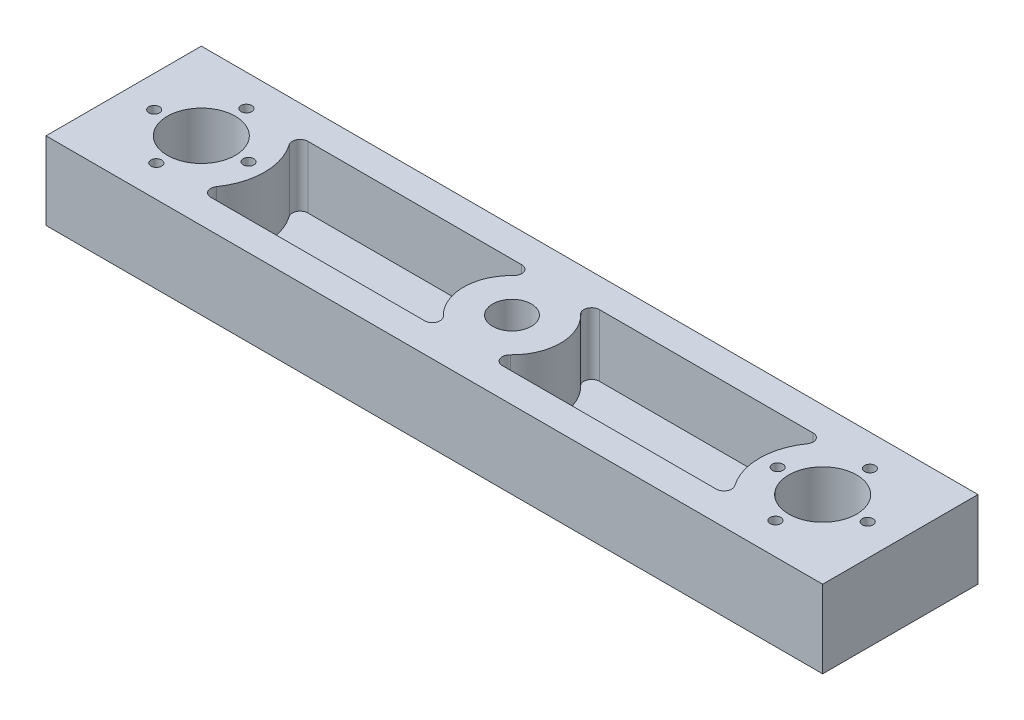
ISO-10303-21;
HEADER;
FILE_DESCRIPTION(('STEP AP214'),'2;1');
FILE_NAME('part.step','',(''),(''),'','','');
FILE_SCHEMA(('AUTOMOTIVE_DESIGN { 1 0 10303 214 1 1 1 1 }'));
ENDSEC;
DATA;
#1=APPLICATION_CONTEXT('core data for automotive mechanical design processes');
#2=APPLICATION_PROTOCOL_DEFINITION('international standard','automotive_design',2000,#1);
#3=PRODUCT_CONTEXT('',#1,'mechanical');
#4=PRODUCT('Part','Part','',(#3));
#5=PRODUCT_RELATED_PRODUCT_CATEGORY('part','',(#4));
#6=PRODUCT_DEFINITION_FORMATION('','',#4);
#7=PRODUCT_DEFINITION_CONTEXT('part definition',#1,'design');
#8=PRODUCT_DEFINITION('design','',#6,#7);
#9=PRODUCT_DEFINITION_SHAPE('','',#8);
#10=(LENGTH_UNIT() NAMED_UNIT(*) SI_UNIT(.MILLI.,.METRE.));
#11=(NAMED_UNIT(*) PLANE_ANGLE_UNIT() SI_UNIT($,.RADIAN.));
#12=(NAMED_UNIT(*) SI_UNIT($,.STERADIAN.) SOLID_ANGLE_UNIT());
#13=UNCERTAINTY_MEASURE_WITH_UNIT(LENGTH_MEASURE(1.E-05),#10,'distance_accuracy_value','');
#14=(GEOMETRIC_REPRESENTATION_CONTEXT(3) GLOBAL_UNCERTAINTY_ASSIGNED_CONTEXT((#13)) GLOBAL_UNIT_ASSIGNED_CONTEXT((#10,
#11,#12)) REPRESENTATION_CONTEXT('',''));
#15=CARTESIAN_POINT('',(0.,0.,0.));
#16=DIRECTION('',(0.,0.,1.));
#17=DIRECTION('',(1.,0.,0.));
#18=AXIS2_PLACEMENT_3D('',#15,#16,#17);
#19=CARTESIAN_POINT('',(0.,25.4,0.));
#20=DIRECTION('',(0.,1.,0.));
#21=DIRECTION('',(0.,0.,1.));
#22=AXIS2_PLACEMENT_3D('',#19,#20,#21);
#23=PLANE('',#22);
#24=CARTESIAN_POINT('',(228.245657607754,25.4,-10.3187499999999));
#25=DIRECTION('',(0.,1.,0.));
#26=DIRECTION('',(0.,0.,1.));
#27=AXIS2_PLACEMENT_3D('',#24,#25,#26);
#28=CIRCLE('',#27,1.75259999999999);
#29=CARTESIAN_POINT('',(228.245657607754,25.4,-8.56614999999991));
#30=VERTEX_POINT('',#29);
#31=EDGE_CURVE('E781',#30,#30,#28,.T.);
#32=ORIENTED_EDGE('',*,*,#31,.F.);
#33=EDGE_LOOP('',(#32));
#34=FACE_BOUND('',#33,.T.);
#35=CARTESIAN_POINT('',(213.51875,25.4,-25.7543423922459));
#36=DIRECTION('',(0.,1.,0.));
#37=DIRECTION('',(0.,0.,1.));
#38=AXIS2_PLACEMENT_3D('',#35,#36,#37);
#39=CIRCLE('',#38,1.75259999999999);
#40=CARTESIAN_POINT('',(213.51875,25.4,-24.0017423922459));
#41=VERTEX_POINT('',#40);
#42=EDGE_CURVE('E783',#41,#41,#39,.T.);
#43=ORIENTED_EDGE('',*,*,#42,.F.);
#44=EDGE_LOOP('',(#43));
#45=FACE_BOUND('',#44,.T.);
#46=CARTESIAN_POINT('',(228.954342392246,25.4,-40.4812500000001));
#47=DIRECTION('',(0.,1.,0.));
#48=DIRECTION('',(0.,0.,1.));
#49=AXIS2_PLACEMENT_3D('',#46,#47,#48);
#50=CIRCLE('',#49,1.75259999999999);
#51=CARTESIAN_POINT('',(228.954342392246,25.4,-38.7286500000001));
#52=VERTEX_POINT('',#51);
#53=EDGE_CURVE('E791',#52,#52,#50,.T.);
#54=ORIENTED_EDGE('',*,*,#53,.F.);
#55=EDGE_LOOP('',(#54));
#56=FACE_BOUND('',#55,.T.);
#57=CARTESIAN_POINT('',(25.045657607754,25.4,-40.48125));
#58=DIRECTION('',(0.,1.,0.));
#59=DIRECTION('',(0.,0.,1.));
#60=AXIS2_PLACEMENT_3D('',#57,#58,#59);
#61=CIRCLE('',#60,1.75259999999999);
#62=CARTESIAN_POINT('',(25.045657607754,25.4,-38.72865));
#63=VERTEX_POINT('',#62);
#64=EDGE_CURVE('E797',#63,#63,#61,.T.);
#65=ORIENTED_EDGE('',*,*,#64,.F.);
#66=EDGE_LOOP('',(#65));
#67=FACE_BOUND('',#66,.T.);
#68=CARTESIAN_POINT('',(40.48125,25.4,-25.7543423922459));
#69=DIRECTION('',(0.,1.,0.));
#70=DIRECTION('',(0.,0.,1.));
#71=AXIS2_PLACEMENT_3D('',#68,#69,#70);
#72=CIRCLE('',#71,1.75259999999999);
#73=CARTESIAN_POINT('',(40.48125,25.4,-24.0017423922459));
#74=VERTEX_POINT('',#73);
#75=EDGE_CURVE('E803',#74,#74,#72,.T.);
#76=ORIENTED_EDGE('',*,*,#75,.F.);
#77=EDGE_LOOP('',(#76));
#78=FACE_BOUND('',#77,.T.);
#79=CARTESIAN_POINT('',(25.7543423922459,25.4,-10.31875));
#80=DIRECTION('',(0.,1.,0.));
#81=DIRECTION('',(0.,0.,1.));
#82=AXIS2_PLACEMENT_3D('',#79,#80,#81);
#83=CIRCLE('',#82,1.75259999999999);
#84=CARTESIAN_POINT('',(25.7543423922459,25.4,-8.56615000000002));
#85=VERTEX_POINT('',#84);
#86=EDGE_CURVE('E808',#85,#85,#83,.T.);
#87=ORIENTED_EDGE('',*,*,#86,.F.);
#88=EDGE_LOOP('',(#87));
#89=FACE_BOUND('',#88,.T.);
#90=CARTESIAN_POINT('',(209.642830347069,25.4,-12.065));
#91=DIRECTION('',(0.,1.,0.));
#92=DIRECTION('',(0.,0.,-1.));
#93=AXIS2_PLACEMENT_3D('',#90,#91,#92);
#94=CIRCLE('',#93,2.54);
#95=CARTESIAN_POINT('',(209.642830347069,25.4,-9.525));
#96=VERTEX_POINT('',#95);
#97=CARTESIAN_POINT('',(211.720328391226,25.4,-13.5263698630137));
#98=VERTEX_POINT('',#97);
#99=EDGE_CURVE('E69',#96,#98,#94,.T.);
#100=ORIENTED_EDGE('',*,*,#99,.F.);
#101=DIRECTION('',(1.,0.,0.));
#102=VECTOR('',#101,1.);
#103=CARTESIAN_POINT('',(209.642830347069,25.4,-9.525));
#104=LINE('',#103,#102);
#105=CARTESIAN_POINT('',(139.7,25.4,-9.52499999999999));
#106=VERTEX_POINT('',#105);
#107=EDGE_CURVE('E274',#106,#96,#104,.T.);
#108=ORIENTED_EDGE('',*,*,#107,.F.);
#109=CARTESIAN_POINT('',(139.7,25.4,-12.065));
#110=DIRECTION('',(0.,1.,0.));
#111=DIRECTION('',(0.,0.,1.));
#112=AXIS2_PLACEMENT_3D('',#109,#110,#111);
#113=CIRCLE('',#112,2.54);
#114=CARTESIAN_POINT('',(137.948275862069,25.4,-13.9043103448276));
#115=VERTEX_POINT('',#114);
#116=EDGE_CURVE('E277',#115,#106,#113,.T.);
#117=ORIENTED_EDGE('',*,*,#116,.F.);
#118=CARTESIAN_POINT('',(127.,25.4,-25.4));
#119=DIRECTION('',(0.,-1.,0.));
#120=DIRECTION('',(0.,0.,-1.));
#121=AXIS2_PLACEMENT_3D('',#118,#119,#120);
#122=CIRCLE('',#121,15.875);
#123=CARTESIAN_POINT('',(137.948275862069,25.4,-36.8956896551724));
#124=VERTEX_POINT('',#123);
#125=EDGE_CURVE('E281',#124,#115,#122,.T.);
#126=ORIENTED_EDGE('',*,*,#125,.F.);
#127=CARTESIAN_POINT('',(139.7,25.4,-38.735));
#128=DIRECTION('',(0.,1.,0.));
#129=DIRECTION('',(0.,0.,-1.));
#130=AXIS2_PLACEMENT_3D('',#127,#128,#129);
#131=CIRCLE('',#130,2.54);
#132=CARTESIAN_POINT('',(139.7,25.4,-41.275));
#133=VERTEX_POINT('',#132);
#134=EDGE_CURVE('E284',#133,#124,#131,.T.);
#135=ORIENTED_EDGE('',*,*,#134,.F.);
#136=DIRECTION('',(-1.,0.,0.));
#137=VECTOR('',#136,1.);
#138=CARTESIAN_POINT('',(209.642830347069,25.4,-41.275));
#139=LINE('',#138,#137);
#140=CARTESIAN_POINT('',(209.642830347069,25.4,-41.275));
#141=VERTEX_POINT('',#140);
#142=EDGE_CURVE('E287',#141,#133,#139,.T.);
#143=ORIENTED_EDGE('',*,*,#142,.F.);
#144=CARTESIAN_POINT('',(209.642830347069,25.4,-38.735));
#145=DIRECTION('',(0.,1.,0.));
#146=DIRECTION('',(0.,0.,1.));
#147=AXIS2_PLACEMENT_3D('',#144,#145,#146);
#148=CIRCLE('',#147,2.54);
#149=CARTESIAN_POINT('',(211.720328391226,25.4,-37.2736301369863));
#150=VERTEX_POINT('',#149);
#151=EDGE_CURVE('E290',#150,#141,#148,.T.);
#152=ORIENTED_EDGE('',*,*,#151,.F.);
#153=CARTESIAN_POINT('',(228.6,25.4,-25.4));
#154=DIRECTION('',(0.,-1.,0.));
#155=DIRECTION('',(0.,0.,1.));
#156=AXIS2_PLACEMENT_3D('',#153,#154,#155);
#157=CIRCLE('',#156,20.6375);
#158=EDGE_CURVE('E293',#98,#150,#157,.T.);
#159=ORIENTED_EDGE('',*,*,#158,.F.);
#160=EDGE_LOOP('',(#100,#108,#117,#126,#135,#143,#152,#159));
#161=FACE_BOUND('',#160,.T.);
#162=CARTESIAN_POINT('',(10.31875,25.4,-25.0456576077541));
#163=DIRECTION('',(0.,1.,0.));
#164=DIRECTION('',(0.,0.,1.));
#165=AXIS2_PLACEMENT_3D('',#162,#163,#164);
#166=CIRCLE('',#165,1.75259999999999);
#167=CARTESIAN_POINT('',(10.31875,25.4,-23.2930576077541));
#168=VERTEX_POINT('',#167);
#169=EDGE_CURVE('E245',#168,#168,#166,.T.);
#170=ORIENTED_EDGE('',*,*,#169,.F.);
#171=EDGE_LOOP('',(#170));
#172=FACE_BOUND('',#171,.T.);
#173=CARTESIAN_POINT('',(243.68125,25.4,-25.0456576077541));
#174=DIRECTION('',(0.,1.,0.));
#175=DIRECTION('',(0.,0.,1.));
#176=AXIS2_PLACEMENT_3D('',#173,#174,#175);
#177=CIRCLE('',#176,1.75259999999999);
#178=CARTESIAN_POINT('',(243.68125,25.4,-23.2930576077542));
#179=VERTEX_POINT('',#178);
#180=EDGE_CURVE('E324',#179,#179,#177,.T.);
#181=ORIENTED_EDGE('',*,*,#180,.F.);
#182=EDGE_LOOP('',(#181));
#183=FACE_BOUND('',#182,.T.);
#184=CARTESIAN_POINT('',(25.4,25.4,-25.4));
#185=DIRECTION('',(0.,1.,0.));
#186=DIRECTION('',(0.,0.,1.));
#187=AXIS2_PLACEMENT_3D('',#184,#185,#186);
#188=CIRCLE('',#187,11.1125);
#189=CARTESIAN_POINT('',(25.4,25.4,-14.2875));
#190=VERTEX_POINT('',#189);
#191=EDGE_CURVE('E335',#190,#190,#188,.T.);
#192=ORIENTED_EDGE('',*,*,#191,.F.);
#193=EDGE_LOOP('',(#192));
#194=FACE_BOUND('',#193,.T.);
#195=CARTESIAN_POINT('',(228.6,25.4,-25.4));
#196=DIRECTION('',(0.,1.,0.));
#197=DIRECTION('',(0.,0.,1.));
#198=AXIS2_PLACEMENT_3D('',#195,#196,#197);
#199=CIRCLE('',#198,11.1125);
#200=CARTESIAN_POINT('',(228.6,25.4,-14.2875));
#201=VERTEX_POINT('',#200);
#202=EDGE_CURVE('E338',#201,#201,#199,.T.);
#203=ORIENTED_EDGE('',*,*,#202,.F.);
#204=EDGE_LOOP('',(#203));
#205=FACE_BOUND('',#204,.T.);
#206=CARTESIAN_POINT('',(127.,25.4,-25.4));
#207=DIRECTION('',(0.,1.,0.));
#208=DIRECTION('',(0.,0.,1.));
#209=AXIS2_PLACEMENT_3D('',#206,#207,#208);
#210=CIRCLE('',#209,6.35000000000002);
#211=CARTESIAN_POINT('',(127.,25.4,-19.05));
#212=VERTEX_POINT('',#211);
#213=EDGE_CURVE('E344',#212,#212,#210,.T.);
#214=ORIENTED_EDGE('',*,*,#213,.F.);
#215=EDGE_LOOP('',(#214));
#216=FACE_BOUND('',#215,.T.);
#217=DIRECTION('',(0.,0.,1.));
#218=VECTOR('',#217,1.);
#219=CARTESIAN_POINT('',(0.,25.4,-50.8));
#220=LINE('',#219,#218);
#221=CARTESIAN_POINT('',(0.,25.4,-50.8));
#222=VERTEX_POINT('',#221);
#223=CARTESIAN_POINT('',(0.,25.4,0.));
#224=VERTEX_POINT('',#223);
#225=EDGE_CURVE('E349',#222,#224,#220,.T.);
#226=ORIENTED_EDGE('',*,*,#225,.T.);
#227=DIRECTION('',(1.,0.,0.));
#228=VECTOR('',#227,1.);
#229=CARTESIAN_POINT('',(0.,25.4,0.));
#230=LINE('',#229,#228);
#231=CARTESIAN_POINT('',(254.,25.4,0.));
#232=VERTEX_POINT('',#231);
#233=EDGE_CURVE('E352',#224,#232,#230,.T.);
#234=ORIENTED_EDGE('',*,*,#233,.T.);
#235=DIRECTION('',(0.,0.,-1.));
#236=VECTOR('',#235,1.);
#237=CARTESIAN_POINT('',(254.,25.4,0.));
#238=LINE('',#237,#236);
#239=CARTESIAN_POINT('',(254.,25.4,-50.8));
#240=VERTEX_POINT('',#239);
#241=EDGE_CURVE('E355',#232,#240,#238,.T.);
#242=ORIENTED_EDGE('',*,*,#241,.T.);
#243=DIRECTION('',(-1.,0.,0.));
#244=VECTOR('',#243,1.);
#245=CARTESIAN_POINT('',(254.,25.4,-50.8));
#246=LINE('',#245,#244);
#247=EDGE_CURVE('E357',#240,#222,#246,.T.);
#248=ORIENTED_EDGE('',*,*,#247,.T.);
#249=EDGE_LOOP('',(#226,#234,#242,#248));
#250=FACE_BOUND('',#249,.T.);
#251=CARTESIAN_POINT('',(44.3571696529308,25.4,-38.735));
#252=DIRECTION('',(0.,1.,0.));
#253=DIRECTION('',(0.,0.,-1.));
#254=AXIS2_PLACEMENT_3D('',#251,#252,#253);
#255=CIRCLE('',#254,2.54);
#256=CARTESIAN_POINT('',(44.3571696529308,25.4,-41.275));
#257=VERTEX_POINT('',#256);
#258=CARTESIAN_POINT('',(42.279671608774,25.4,-37.2736301369863));
#259=VERTEX_POINT('',#258);
#260=EDGE_CURVE('E61',#257,#259,#255,.T.);
#261=ORIENTED_EDGE('',*,*,#260,.F.);
#262=DIRECTION('',(-1.,0.,0.));
#263=VECTOR('',#262,1.);
#264=CARTESIAN_POINT('',(44.3571696529308,25.4,-41.275));
#265=LINE('',#264,#263);
#266=CARTESIAN_POINT('',(114.3,25.4,-41.275));
#267=VERTEX_POINT('',#266);
#268=EDGE_CURVE('E204',#267,#257,#265,.T.);
#269=ORIENTED_EDGE('',*,*,#268,.F.);
#270=CARTESIAN_POINT('',(114.3,25.4,-38.735));
#271=DIRECTION('',(0.,1.,0.));
#272=DIRECTION('',(0.,0.,-1.));
#273=AXIS2_PLACEMENT_3D('',#270,#271,#272);
#274=CIRCLE('',#273,2.54);
#275=CARTESIAN_POINT('',(116.051724137931,25.4,-36.8956896551724));
#276=VERTEX_POINT('',#275);
#277=EDGE_CURVE('E207',#276,#267,#274,.T.);
#278=ORIENTED_EDGE('',*,*,#277,.F.);
#279=CARTESIAN_POINT('',(127.,25.4,-25.4));
#280=DIRECTION('',(0.,-1.,0.));
#281=DIRECTION('',(0.,0.,1.));
#282=AXIS2_PLACEMENT_3D('',#279,#280,#281);
#283=CIRCLE('',#282,15.875);
#284=CARTESIAN_POINT('',(116.051724137931,25.4,-13.9043103448276));
#285=VERTEX_POINT('',#284);
#286=EDGE_CURVE('E238',#285,#276,#283,.T.);
#287=ORIENTED_EDGE('',*,*,#286,.F.);
#288=CARTESIAN_POINT('',(114.3,25.4,-12.065));
#289=DIRECTION('',(0.,1.,0.));
#290=DIRECTION('',(0.,0.,1.));
#291=AXIS2_PLACEMENT_3D('',#288,#289,#290);
#292=CIRCLE('',#291,2.54);
#293=CARTESIAN_POINT('',(114.3,25.4,-9.525));
#294=VERTEX_POINT('',#293);
#295=EDGE_CURVE('E235',#294,#285,#292,.T.);
#296=ORIENTED_EDGE('',*,*,#295,.F.);
#297=DIRECTION('',(1.,0.,0.));
#298=VECTOR('',#297,1.);
#299=CARTESIAN_POINT('',(44.3571696529308,25.4,-9.525));
#300=LINE('',#299,#298);
#301=CARTESIAN_POINT('',(44.3571696529308,25.4,-9.525));
#302=VERTEX_POINT('',#301);
#303=EDGE_CURVE('E232',#302,#294,#300,.T.);
#304=ORIENTED_EDGE('',*,*,#303,.F.);
#305=CARTESIAN_POINT('',(44.3571696529308,25.4,-12.065));
#306=DIRECTION('',(0.,1.,0.));
#307=DIRECTION('',(0.,0.,-1.));
#308=AXIS2_PLACEMENT_3D('',#305,#306,#307);
#309=CIRCLE('',#308,2.54);
#310=CARTESIAN_POINT('',(42.279671608774,25.4,-13.5263698630137));
#311=VERTEX_POINT('',#310);
#312=EDGE_CURVE('E229',#311,#302,#309,.T.);
#313=ORIENTED_EDGE('',*,*,#312,.F.);
#314=CARTESIAN_POINT('',(25.4,25.4,-25.4));
#315=DIRECTION('',(0.,-1.,0.));
#316=DIRECTION('',(0.,0.,-1.));
#317=AXIS2_PLACEMENT_3D('',#314,#315,#316);
#318=CIRCLE('',#317,20.6375);
#319=EDGE_CURVE('E227',#259,#311,#318,.T.);
#320=ORIENTED_EDGE('',*,*,#319,.F.);
#321=EDGE_LOOP('',(#261,#269,#278,#287,#296,#304,#313,#320));
#322=FACE_BOUND('',#321,.T.);
#323=ADVANCED_FACE('F46',(#34,#45,#56,#67,#78,#89,#161,#172,#183,#194,#205,#216,#250,#322),#23,.T.);
#324=CARTESIAN_POINT('',(0.,25.4,-50.8));
#325=DIRECTION('',(1.,0.,0.));
#326=DIRECTION('',(0.,0.,-1.));
#327=AXIS2_PLACEMENT_3D('',#324,#325,#326);
#328=PLANE('',#327);
#329=DIRECTION('',(0.,0.,1.));
#330=VECTOR('',#329,1.);
#331=CARTESIAN_POINT('',(0.,0.,-50.8));
#332=LINE('',#331,#330);
#333=CARTESIAN_POINT('',(0.,0.,-50.8));
#334=VERTEX_POINT('',#333);
#335=CARTESIAN_POINT('',(0.,0.,0.));
#336=VERTEX_POINT('',#335);
#337=EDGE_CURVE('E334',#334,#336,#332,.T.);
#338=ORIENTED_EDGE('',*,*,#337,.T.);
#339=DIRECTION('',(0.,-1.,0.));
#340=VECTOR('',#339,1.);
#341=CARTESIAN_POINT('',(0.,25.4,0.));
#342=LINE('',#341,#340);
#343=EDGE_CURVE('E11',#224,#336,#342,.T.);
#344=ORIENTED_EDGE('',*,*,#343,.F.);
#345=ORIENTED_EDGE('',*,*,#225,.F.);
#346=DIRECTION('',(0.,-1.,0.));
#347=VECTOR('',#346,1.);
#348=CARTESIAN_POINT('',(0.,25.4,-50.8));
#349=LINE('',#348,#347);
#350=EDGE_CURVE('E359',#222,#334,#349,.T.);
#351=ORIENTED_EDGE('',*,*,#350,.T.);
#352=EDGE_LOOP('',(#338,#344,#345,#351));
#353=FACE_BOUND('',#352,.T.);
#354=ADVANCED_FACE('F48',(#353),#328,.F.);
#355=CARTESIAN_POINT('',(0.,25.4,0.));
#356=DIRECTION('',(0.,0.,-1.));
#357=DIRECTION('',(-1.,0.,0.));
#358=AXIS2_PLACEMENT_3D('',#355,#356,#357);
#359=PLANE('',#358);
#360=DIRECTION('',(1.,0.,0.));
#361=VECTOR('',#360,1.);
#362=CARTESIAN_POINT('',(0.,0.,0.));
#363=LINE('',#362,#361);
#364=CARTESIAN_POINT('',(254.,0.,0.));
#365=VERTEX_POINT('',#364);
#366=EDGE_CURVE('E362',#336,#365,#363,.T.);
#367=ORIENTED_EDGE('',*,*,#366,.T.);
#368=DIRECTION('',(0.,-1.,0.));
#369=VECTOR('',#368,1.);
#370=CARTESIAN_POINT('',(254.,25.4,0.));
#371=LINE('',#370,#369);
#372=EDGE_CURVE('E54',#232,#365,#371,.T.);
#373=ORIENTED_EDGE('',*,*,#372,.F.);
#374=ORIENTED_EDGE('',*,*,#233,.F.);
#375=ORIENTED_EDGE('',*,*,#343,.T.);
#376=EDGE_LOOP('',(#367,#373,#374,#375));
#377=FACE_BOUND('',#376,.T.);
#378=ADVANCED_FACE('F392',(#377),#359,.F.);
#379=CARTESIAN_POINT('',(254.,25.4,0.));
#380=DIRECTION('',(-1.,0.,0.));
#381=DIRECTION('',(0.,0.,1.));
#382=AXIS2_PLACEMENT_3D('',#379,#380,#381);
#383=PLANE('',#382);
#384=DIRECTION('',(0.,0.,-1.));
#385=VECTOR('',#384,1.);
#386=CARTESIAN_POINT('',(254.,0.,0.));
#387=LINE('',#386,#385);
#388=CARTESIAN_POINT('',(254.,0.,-50.8));
#389=VERTEX_POINT('',#388);
#390=EDGE_CURVE('E364',#365,#389,#387,.T.);
#391=ORIENTED_EDGE('',*,*,#390,.T.);
#392=DIRECTION('',(0.,-1.,0.));
#393=VECTOR('',#392,1.);
#394=CARTESIAN_POINT('',(254.,25.4,-50.8));
#395=LINE('',#394,#393);
#396=EDGE_CURVE('E369',#240,#389,#395,.T.);
#397=ORIENTED_EDGE('',*,*,#396,.F.);
#398=ORIENTED_EDGE('',*,*,#241,.F.);
#399=ORIENTED_EDGE('',*,*,#372,.T.);
#400=EDGE_LOOP('',(#391,#397,#398,#399));
#401=FACE_BOUND('',#400,.T.);
#402=ADVANCED_FACE('F376',(#401),#383,.F.);
#403=CARTESIAN_POINT('',(254.,25.4,-50.8));
#404=DIRECTION('',(0.,0.,1.));
#405=DIRECTION('',(1.,0.,0.));
#406=AXIS2_PLACEMENT_3D('',#403,#404,#405);
#407=PLANE('',#406);
#408=DIRECTION('',(-1.,0.,0.));
#409=VECTOR('',#408,1.);
#410=CARTESIAN_POINT('',(254.,0.,-50.8));
#411=LINE('',#410,#409);
#412=EDGE_CURVE('E353',#389,#334,#411,.T.);
#413=ORIENTED_EDGE('',*,*,#412,.T.);
#414=ORIENTED_EDGE('',*,*,#350,.F.);
#415=ORIENTED_EDGE('',*,*,#247,.F.);
#416=ORIENTED_EDGE('',*,*,#396,.T.);
#417=EDGE_LOOP('',(#413,#414,#415,#416));
#418=FACE_BOUND('',#417,.T.);
#419=ADVANCED_FACE('F385',(#418),#407,.F.);
#420=CARTESIAN_POINT('',(0.,0.,0.));
#421=DIRECTION('',(0.,1.,0.));
#422=DIRECTION('',(0.,0.,1.));
#423=AXIS2_PLACEMENT_3D('',#420,#421,#422);
#424=PLANE('',#423);
#425=CARTESIAN_POINT('',(228.245657607754,0.,-10.3187499999999));
#426=DIRECTION('',(0.,1.,0.));
#427=DIRECTION('',(0.,0.,1.));
#428=AXIS2_PLACEMENT_3D('',#425,#426,#427);
#429=CIRCLE('',#428,1.75259999999999);
#430=CARTESIAN_POINT('',(228.245657607754,0.,-8.56614999999991));
#431=VERTEX_POINT('',#430);
#432=EDGE_CURVE('E779',#431,#431,#429,.T.);
#433=ORIENTED_EDGE('',*,*,#432,.T.);
#434=EDGE_LOOP('',(#433));
#435=FACE_BOUND('',#434,.T.);
#436=CARTESIAN_POINT('',(213.51875,0.,-25.7543423922459));
#437=DIRECTION('',(0.,1.,0.));
#438=DIRECTION('',(0.,0.,1.));
#439=AXIS2_PLACEMENT_3D('',#436,#437,#438);
#440=CIRCLE('',#439,1.75259999999999);
#441=CARTESIAN_POINT('',(213.51875,0.,-24.0017423922459));
#442=VERTEX_POINT('',#441);
#443=EDGE_CURVE('E788',#442,#442,#440,.T.);
#444=ORIENTED_EDGE('',*,*,#443,.T.);
#445=EDGE_LOOP('',(#444));
#446=FACE_BOUND('',#445,.T.);
#447=CARTESIAN_POINT('',(228.954342392246,0.,-40.4812500000001));
#448=DIRECTION('',(0.,1.,0.));
#449=DIRECTION('',(0.,0.,1.));
#450=AXIS2_PLACEMENT_3D('',#447,#448,#449);
#451=CIRCLE('',#450,1.75259999999999);
#452=CARTESIAN_POINT('',(228.954342392246,0.,-38.7286500000001));
#453=VERTEX_POINT('',#452);
#454=EDGE_CURVE('E794',#453,#453,#451,.T.);
#455=ORIENTED_EDGE('',*,*,#454,.T.);
#456=EDGE_LOOP('',(#455));
#457=FACE_BOUND('',#456,.T.);
#458=CARTESIAN_POINT('',(25.045657607754,0.,-40.48125));
#459=DIRECTION('',(0.,1.,0.));
#460=DIRECTION('',(0.,0.,1.));
#461=AXIS2_PLACEMENT_3D('',#458,#459,#460);
#462=CIRCLE('',#461,1.75259999999999);
#463=CARTESIAN_POINT('',(25.045657607754,0.,-38.72865));
#464=VERTEX_POINT('',#463);
#465=EDGE_CURVE('E800',#464,#464,#462,.T.);
#466=ORIENTED_EDGE('',*,*,#465,.T.);
#467=EDGE_LOOP('',(#466));
#468=FACE_BOUND('',#467,.T.);
#469=CARTESIAN_POINT('',(40.48125,0.,-25.7543423922459));
#470=DIRECTION('',(0.,1.,0.));
#471=DIRECTION('',(0.,0.,1.));
#472=AXIS2_PLACEMENT_3D('',#469,#470,#471);
#473=CIRCLE('',#472,1.75259999999999);
#474=CARTESIAN_POINT('',(40.48125,0.,-24.0017423922459));
#475=VERTEX_POINT('',#474);
#476=EDGE_CURVE('E806',#475,#475,#473,.T.);
#477=ORIENTED_EDGE('',*,*,#476,.T.);
#478=EDGE_LOOP('',(#477));
#479=FACE_BOUND('',#478,.T.);
#480=CARTESIAN_POINT('',(25.7543423922459,0.,-10.31875));
#481=DIRECTION('',(0.,1.,0.));
#482=DIRECTION('',(0.,0.,1.));
#483=AXIS2_PLACEMENT_3D('',#480,#481,#482);
#484=CIRCLE('',#483,1.75259999999999);
#485=CARTESIAN_POINT('',(25.7543423922459,0.,-8.56615000000001));
#486=VERTEX_POINT('',#485);
#487=EDGE_CURVE('E210',#486,#486,#484,.T.);
#488=ORIENTED_EDGE('',*,*,#487,.T.);
#489=EDGE_LOOP('',(#488));
#490=FACE_BOUND('',#489,.T.);
#491=CARTESIAN_POINT('',(10.31875,0.,-25.0456576077541));
#492=DIRECTION('',(0.,1.,0.));
#493=DIRECTION('',(0.,0.,1.));
#494=AXIS2_PLACEMENT_3D('',#491,#492,#493);
#495=CIRCLE('',#494,1.75259999999999);
#496=CARTESIAN_POINT('',(10.31875,0.,-23.2930576077541));
#497=VERTEX_POINT('',#496);
#498=EDGE_CURVE('E321',#497,#497,#495,.T.);
#499=ORIENTED_EDGE('',*,*,#498,.T.);
#500=EDGE_LOOP('',(#499));
#501=FACE_BOUND('',#500,.T.);
#502=CARTESIAN_POINT('',(243.68125,0.,-25.0456576077541));
#503=DIRECTION('',(0.,1.,0.));
#504=DIRECTION('',(0.,0.,1.));
#505=AXIS2_PLACEMENT_3D('',#502,#503,#504);
#506=CIRCLE('',#505,1.75259999999999);
#507=CARTESIAN_POINT('',(243.68125,0.,-23.2930576077542));
#508=VERTEX_POINT('',#507);
#509=EDGE_CURVE('E327',#508,#508,#506,.T.);
#510=ORIENTED_EDGE('',*,*,#509,.T.);
#511=EDGE_LOOP('',(#510));
#512=FACE_BOUND('',#511,.T.);
#513=CARTESIAN_POINT('',(25.4,0.,-25.4));
#514=DIRECTION('',(0.,1.,0.));
#515=DIRECTION('',(0.,0.,1.));
#516=AXIS2_PLACEMENT_3D('',#513,#514,#515);
#517=CIRCLE('',#516,11.1125);
#518=CARTESIAN_POINT('',(25.4,0.,-14.2875));
#519=VERTEX_POINT('',#518);
#520=EDGE_CURVE('E331',#519,#519,#517,.T.);
#521=ORIENTED_EDGE('',*,*,#520,.T.);
#522=EDGE_LOOP('',(#521));
#523=FACE_BOUND('',#522,.T.);
#524=CARTESIAN_POINT('',(228.6,0.,-25.4));
#525=DIRECTION('',(0.,1.,0.));
#526=DIRECTION('',(0.,0.,1.));
#527=AXIS2_PLACEMENT_3D('',#524,#525,#526);
#528=CIRCLE('',#527,11.1125);
#529=CARTESIAN_POINT('',(228.6,0.,-14.2875));
#530=VERTEX_POINT('',#529);
#531=EDGE_CURVE('E341',#530,#530,#528,.T.);
#532=ORIENTED_EDGE('',*,*,#531,.T.);
#533=EDGE_LOOP('',(#532));
#534=FACE_BOUND('',#533,.T.);
#535=CARTESIAN_POINT('',(127.,0.,-25.4));
#536=DIRECTION('',(0.,1.,0.));
#537=DIRECTION('',(0.,0.,1.));
#538=AXIS2_PLACEMENT_3D('',#535,#536,#537);
#539=CIRCLE('',#538,6.35000000000002);
#540=CARTESIAN_POINT('',(127.,0.,-19.05));
#541=VERTEX_POINT('',#540);
#542=EDGE_CURVE('E330',#541,#541,#539,.T.);
#543=ORIENTED_EDGE('',*,*,#542,.T.);
#544=EDGE_LOOP('',(#543));
#545=FACE_BOUND('',#544,.T.);
#546=ORIENTED_EDGE('',*,*,#337,.F.);
#547=ORIENTED_EDGE('',*,*,#412,.F.);
#548=ORIENTED_EDGE('',*,*,#390,.F.);
#549=ORIENTED_EDGE('',*,*,#366,.F.);
#550=EDGE_LOOP('',(#546,#547,#548,#549));
#551=FACE_BOUND('',#550,.T.);
#552=ADVANCED_FACE('F382',(#435,#446,#457,#468,#479,#490,#501,#512,#523,#534,#545,#551),#424,.F.);
#553=CARTESIAN_POINT('',(127.,0.,-25.4));
#554=DIRECTION('',(0.,1.,0.));
#555=DIRECTION('',(0.,0.,1.));
#556=AXIS2_PLACEMENT_3D('',#553,#554,#555);
#557=CYLINDRICAL_SURFACE('',#556,6.35000000000002);
#558=ORIENTED_EDGE('',*,*,#542,.F.);
#559=EDGE_LOOP('',(#558));
#560=FACE_BOUND('',#559,.T.);
#561=ORIENTED_EDGE('',*,*,#213,.T.);
#562=EDGE_LOOP('',(#561));
#563=FACE_BOUND('',#562,.T.);
#564=ADVANCED_FACE('F410',(#560,#563),#557,.F.);
#565=CARTESIAN_POINT('',(228.6,0.,-25.4));
#566=DIRECTION('',(0.,1.,0.));
#567=DIRECTION('',(0.,0.,1.));
#568=AXIS2_PLACEMENT_3D('',#565,#566,#567);
#569=CYLINDRICAL_SURFACE('',#568,11.1125);
#570=ORIENTED_EDGE('',*,*,#531,.F.);
#571=EDGE_LOOP('',(#570));
#572=FACE_BOUND('',#571,.T.);
#573=ORIENTED_EDGE('',*,*,#202,.T.);
#574=EDGE_LOOP('',(#573));
#575=FACE_BOUND('',#574,.T.);
#576=ADVANCED_FACE('F427',(#572,#575),#569,.F.);
#577=CARTESIAN_POINT('',(25.4,0.,-25.4));
#578=DIRECTION('',(0.,1.,0.));
#579=DIRECTION('',(0.,0.,1.));
#580=AXIS2_PLACEMENT_3D('',#577,#578,#579);
#581=CYLINDRICAL_SURFACE('',#580,11.1125);
#582=ORIENTED_EDGE('',*,*,#520,.F.);
#583=EDGE_LOOP('',(#582));
#584=FACE_BOUND('',#583,.T.);
#585=ORIENTED_EDGE('',*,*,#191,.T.);
#586=EDGE_LOOP('',(#585));
#587=FACE_BOUND('',#586,.T.);
#588=ADVANCED_FACE('F435',(#584,#587),#581,.F.);
#589=CARTESIAN_POINT('',(243.68125,25.4,-25.0456576077541));
#590=DIRECTION('',(0.,1.,0.));
#591=DIRECTION('',(0.,0.,1.));
#592=AXIS2_PLACEMENT_3D('',#589,#590,#591);
#593=CYLINDRICAL_SURFACE('',#592,1.75259999999999);
#594=ORIENTED_EDGE('',*,*,#509,.F.);
#595=EDGE_LOOP('',(#594));
#596=FACE_BOUND('',#595,.T.);
#597=ORIENTED_EDGE('',*,*,#180,.T.);
#598=EDGE_LOOP('',(#597));
#599=FACE_BOUND('',#598,.T.);
#600=ADVANCED_FACE('F443',(#596,#599),#593,.F.);
#601=CARTESIAN_POINT('',(10.31875,25.4,-25.0456576077541));
#602=DIRECTION('',(0.,1.,0.));
#603=DIRECTION('',(0.,0.,1.));
#604=AXIS2_PLACEMENT_3D('',#601,#602,#603);
#605=CYLINDRICAL_SURFACE('',#604,1.75259999999999);
#606=ORIENTED_EDGE('',*,*,#498,.F.);
#607=EDGE_LOOP('',(#606));
#608=FACE_BOUND('',#607,.T.);
#609=ORIENTED_EDGE('',*,*,#169,.T.);
#610=EDGE_LOOP('',(#609));
#611=FACE_BOUND('',#610,.T.);
#612=ADVANCED_FACE('F452',(#608,#611),#605,.F.);
#613=CARTESIAN_POINT('',(209.642830347069,5.08,-12.065));
#614=DIRECTION('',(0.,1.,0.));
#615=DIRECTION('',(0.,0.,1.));
#616=AXIS2_PLACEMENT_3D('',#613,#614,#615);
#617=CYLINDRICAL_SURFACE('',#616,2.54);
#618=ORIENTED_EDGE('',*,*,#99,.T.);
#619=DIRECTION('',(0.,1.,0.));
#620=VECTOR('',#619,1.);
#621=CARTESIAN_POINT('',(211.720328391226,5.08,-13.5263698630137));
#622=LINE('',#621,#620);
#623=CARTESIAN_POINT('',(211.720328391226,5.08,-13.5263698630137));
#624=VERTEX_POINT('',#623);
#625=EDGE_CURVE('E257',#624,#98,#622,.T.);
#626=ORIENTED_EDGE('',*,*,#625,.F.);
#627=CARTESIAN_POINT('',(209.642830347069,5.08,-12.065));
#628=DIRECTION('',(0.,1.,0.));
#629=DIRECTION('',(0.,0.,-1.));
#630=AXIS2_PLACEMENT_3D('',#627,#628,#629);
#631=CIRCLE('',#630,2.54);
#632=CARTESIAN_POINT('',(209.642830347069,5.08,-9.525));
#633=VERTEX_POINT('',#632);
#634=EDGE_CURVE('E278',#633,#624,#631,.T.);
#635=ORIENTED_EDGE('',*,*,#634,.F.);
#636=DIRECTION('',(0.,1.,0.));
#637=VECTOR('',#636,1.);
#638=CARTESIAN_POINT('',(209.642830347069,5.08,-9.525));
#639=LINE('',#638,#637);
#640=EDGE_CURVE('E272',#633,#96,#639,.T.);
#641=ORIENTED_EDGE('',*,*,#640,.T.);
#642=EDGE_LOOP('',(#618,#626,#635,#641));
#643=FACE_BOUND('',#642,.T.);
#644=ADVANCED_FACE('F461',(#643),#617,.F.);
#645=CARTESIAN_POINT('',(209.642830347069,5.08,-9.525));
#646=DIRECTION('',(0.,0.,1.));
#647=DIRECTION('',(1.,0.,0.));
#648=AXIS2_PLACEMENT_3D('',#645,#646,#647);
#649=PLANE('',#648);
#650=ORIENTED_EDGE('',*,*,#107,.T.);
#651=ORIENTED_EDGE('',*,*,#640,.F.);
#652=DIRECTION('',(1.,0.,0.));
#653=VECTOR('',#652,1.);
#654=CARTESIAN_POINT('',(209.642830347069,5.08,-9.525));
#655=LINE('',#654,#653);
#656=CARTESIAN_POINT('',(139.7,5.08,-9.52499999999999));
#657=VERTEX_POINT('',#656);
#658=EDGE_CURVE('E259',#657,#633,#655,.T.);
#659=ORIENTED_EDGE('',*,*,#658,.F.);
#660=DIRECTION('',(0.,1.,0.));
#661=VECTOR('',#660,1.);
#662=CARTESIAN_POINT('',(139.7,5.08,-9.52499999999999));
#663=LINE('',#662,#661);
#664=EDGE_CURVE('E270',#657,#106,#663,.T.);
#665=ORIENTED_EDGE('',*,*,#664,.T.);
#666=EDGE_LOOP('',(#650,#651,#659,#665));
#667=FACE_BOUND('',#666,.T.);
#668=ADVANCED_FACE('F470',(#667),#649,.F.);
#669=CARTESIAN_POINT('',(139.7,5.08,-12.065));
#670=DIRECTION('',(0.,1.,0.));
#671=DIRECTION('',(0.,0.,1.));
#672=AXIS2_PLACEMENT_3D('',#669,#670,#671);
#673=CYLINDRICAL_SURFACE('',#672,2.54);
#674=ORIENTED_EDGE('',*,*,#116,.T.);
#675=ORIENTED_EDGE('',*,*,#664,.F.);
#676=CARTESIAN_POINT('',(139.7,5.08,-12.065));
#677=DIRECTION('',(0.,1.,0.));
#678=DIRECTION('',(0.,0.,1.));
#679=AXIS2_PLACEMENT_3D('',#676,#677,#678);
#680=CIRCLE('',#679,2.54);
#681=CARTESIAN_POINT('',(137.948275862069,5.08,-13.9043103448276));
#682=VERTEX_POINT('',#681);
#683=EDGE_CURVE('E299',#682,#657,#680,.T.);
#684=ORIENTED_EDGE('',*,*,#683,.F.);
#685=DIRECTION('',(0.,1.,0.));
#686=VECTOR('',#685,1.);
#687=CARTESIAN_POINT('',(137.948275862069,5.08,-13.9043103448276));
#688=LINE('',#687,#686);
#689=EDGE_CURVE('E268',#682,#115,#688,.T.);
#690=ORIENTED_EDGE('',*,*,#689,.T.);
#691=EDGE_LOOP('',(#674,#675,#684,#690));
#692=FACE_BOUND('',#691,.T.);
#693=ADVANCED_FACE('F478',(#692),#673,.F.);
#694=CARTESIAN_POINT('',(127.,5.08,-25.4));
#695=DIRECTION('',(0.,1.,0.));
#696=DIRECTION('',(0.,0.,1.));
#697=AXIS2_PLACEMENT_3D('',#694,#695,#696);
#698=CYLINDRICAL_SURFACE('',#697,15.875);
#699=ORIENTED_EDGE('',*,*,#125,.T.);
#700=ORIENTED_EDGE('',*,*,#689,.F.);
#701=CARTESIAN_POINT('',(127.,5.08,-25.4));
#702=DIRECTION('',(0.,-1.,0.));
#703=DIRECTION('',(0.,0.,-1.));
#704=AXIS2_PLACEMENT_3D('',#701,#702,#703);
#705=CIRCLE('',#704,15.875);
#706=CARTESIAN_POINT('',(137.948275862069,5.08,-36.8956896551724));
#707=VERTEX_POINT('',#706);
#708=EDGE_CURVE('E302',#707,#682,#705,.T.);
#709=ORIENTED_EDGE('',*,*,#708,.F.);
#710=DIRECTION('',(0.,1.,0.));
#711=VECTOR('',#710,1.);
#712=CARTESIAN_POINT('',(137.948275862069,5.08,-36.8956896551724));
#713=LINE('',#712,#711);
#714=EDGE_CURVE('E266',#707,#124,#713,.T.);
#715=ORIENTED_EDGE('',*,*,#714,.T.);
#716=EDGE_LOOP('',(#699,#700,#709,#715));
#717=FACE_BOUND('',#716,.T.);
#718=ADVANCED_FACE('F487',(#717),#698,.T.);
#719=CARTESIAN_POINT('',(139.7,5.08,-38.735));
#720=DIRECTION('',(0.,1.,0.));
#721=DIRECTION('',(0.,0.,1.));
#722=AXIS2_PLACEMENT_3D('',#719,#720,#721);
#723=CYLINDRICAL_SURFACE('',#722,2.54);
#724=ORIENTED_EDGE('',*,*,#134,.T.);
#725=ORIENTED_EDGE('',*,*,#714,.F.);
#726=CARTESIAN_POINT('',(139.7,5.08,-38.735));
#727=DIRECTION('',(0.,1.,0.));
#728=DIRECTION('',(0.,0.,-1.));
#729=AXIS2_PLACEMENT_3D('',#726,#727,#728);
#730=CIRCLE('',#729,2.54);
#731=CARTESIAN_POINT('',(139.7,5.08,-41.275));
#732=VERTEX_POINT('',#731);
#733=EDGE_CURVE('E305',#732,#707,#730,.T.);
#734=ORIENTED_EDGE('',*,*,#733,.F.);
#735=DIRECTION('',(0.,1.,0.));
#736=VECTOR('',#735,1.);
#737=CARTESIAN_POINT('',(139.7,5.08,-41.275));
#738=LINE('',#737,#736);
#739=EDGE_CURVE('E264',#732,#133,#738,.T.);
#740=ORIENTED_EDGE('',*,*,#739,.T.);
#741=EDGE_LOOP('',(#724,#725,#734,#740));
#742=FACE_BOUND('',#741,.T.);
#743=ADVANCED_FACE('F496',(#742),#723,.F.);
#744=CARTESIAN_POINT('',(209.642830347069,5.08,-41.275));
#745=DIRECTION('',(0.,0.,-1.));
#746=DIRECTION('',(-1.,0.,0.));
#747=AXIS2_PLACEMENT_3D('',#744,#745,#746);
#748=PLANE('',#747);
#749=ORIENTED_EDGE('',*,*,#142,.T.);
#750=ORIENTED_EDGE('',*,*,#739,.F.);
#751=DIRECTION('',(-1.,0.,0.));
#752=VECTOR('',#751,1.);
#753=CARTESIAN_POINT('',(209.642830347069,5.08,-41.275));
#754=LINE('',#753,#752);
#755=CARTESIAN_POINT('',(209.642830347069,5.08,-41.275));
#756=VERTEX_POINT('',#755);
#757=EDGE_CURVE('E308',#756,#732,#754,.T.);
#758=ORIENTED_EDGE('',*,*,#757,.F.);
#759=DIRECTION('',(0.,1.,0.));
#760=VECTOR('',#759,1.);
#761=CARTESIAN_POINT('',(209.642830347069,5.08,-41.275));
#762=LINE('',#761,#760);
#763=EDGE_CURVE('E262',#756,#141,#762,.T.);
#764=ORIENTED_EDGE('',*,*,#763,.T.);
#765=EDGE_LOOP('',(#749,#750,#758,#764));
#766=FACE_BOUND('',#765,.T.);
#767=ADVANCED_FACE('F505',(#766),#748,.F.);
#768=CARTESIAN_POINT('',(209.642830347069,5.08,-38.735));
#769=DIRECTION('',(0.,1.,0.));
#770=DIRECTION('',(0.,0.,1.));
#771=AXIS2_PLACEMENT_3D('',#768,#769,#770);
#772=CYLINDRICAL_SURFACE('',#771,2.54);
#773=ORIENTED_EDGE('',*,*,#151,.T.);
#774=ORIENTED_EDGE('',*,*,#763,.F.);
#775=CARTESIAN_POINT('',(209.642830347069,5.08,-38.735));
#776=DIRECTION('',(0.,1.,0.));
#777=DIRECTION('',(0.,0.,1.));
#778=AXIS2_PLACEMENT_3D('',#775,#776,#777);
#779=CIRCLE('',#778,2.54);
#780=CARTESIAN_POINT('',(211.720328391226,5.08,-37.2736301369863));
#781=VERTEX_POINT('',#780);
#782=EDGE_CURVE('E311',#781,#756,#779,.T.);
#783=ORIENTED_EDGE('',*,*,#782,.F.);
#784=DIRECTION('',(0.,1.,0.));
#785=VECTOR('',#784,1.);
#786=CARTESIAN_POINT('',(211.720328391226,5.08,-37.2736301369863));
#787=LINE('',#786,#785);
#788=EDGE_CURVE('E260',#781,#150,#787,.T.);
#789=ORIENTED_EDGE('',*,*,#788,.T.);
#790=EDGE_LOOP('',(#773,#774,#783,#789));
#791=FACE_BOUND('',#790,.T.);
#792=ADVANCED_FACE('F514',(#791),#772,.F.);
#793=CARTESIAN_POINT('',(228.6,5.08,-25.4));
#794=DIRECTION('',(0.,1.,0.));
#795=DIRECTION('',(0.,0.,1.));
#796=AXIS2_PLACEMENT_3D('',#793,#794,#795);
#797=CYLINDRICAL_SURFACE('',#796,20.6375);
#798=ORIENTED_EDGE('',*,*,#158,.T.);
#799=ORIENTED_EDGE('',*,*,#788,.F.);
#800=CARTESIAN_POINT('',(228.6,5.08,-25.4));
#801=DIRECTION('',(0.,-1.,0.));
#802=DIRECTION('',(0.,0.,1.));
#803=AXIS2_PLACEMENT_3D('',#800,#801,#802);
#804=CIRCLE('',#803,20.6375);
#805=EDGE_CURVE('E314',#624,#781,#804,.T.);
#806=ORIENTED_EDGE('',*,*,#805,.F.);
#807=ORIENTED_EDGE('',*,*,#625,.T.);
#808=EDGE_LOOP('',(#798,#799,#806,#807));
#809=FACE_BOUND('',#808,.T.);
#810=ADVANCED_FACE('F523',(#809),#797,.T.);
#811=CARTESIAN_POINT('',(209.642830347069,5.08,-12.065));
#812=DIRECTION('',(0.,-1.,0.));
#813=DIRECTION('',(0.,0.,-1.));
#814=AXIS2_PLACEMENT_3D('',#811,#812,#813);
#815=PLANE('',#814);
#816=ORIENTED_EDGE('',*,*,#634,.T.);
#817=ORIENTED_EDGE('',*,*,#805,.T.);
#818=ORIENTED_EDGE('',*,*,#782,.T.);
#819=ORIENTED_EDGE('',*,*,#757,.T.);
#820=ORIENTED_EDGE('',*,*,#733,.T.);
#821=ORIENTED_EDGE('',*,*,#708,.T.);
#822=ORIENTED_EDGE('',*,*,#683,.T.);
#823=ORIENTED_EDGE('',*,*,#658,.T.);
#824=EDGE_LOOP('',(#816,#817,#818,#819,#820,#821,#822,#823));
#825=FACE_BOUND('',#824,.T.);
#826=ADVANCED_FACE('F532',(#825),#815,.F.);
#827=CARTESIAN_POINT('',(44.3571696529308,5.08,-38.735));
#828=DIRECTION('',(0.,1.,0.));
#829=DIRECTION('',(0.,0.,1.));
#830=AXIS2_PLACEMENT_3D('',#827,#828,#829);
#831=CYLINDRICAL_SURFACE('',#830,2.54);
#832=ORIENTED_EDGE('',*,*,#260,.T.);
#833=DIRECTION('',(0.,1.,0.));
#834=VECTOR('',#833,1.);
#835=CARTESIAN_POINT('',(42.279671608774,5.08,-37.2736301369863));
#836=LINE('',#835,#834);
#837=CARTESIAN_POINT('',(42.279671608774,5.08,-37.2736301369863));
#838=VERTEX_POINT('',#837);
#839=EDGE_CURVE('E181',#838,#259,#836,.T.);
#840=ORIENTED_EDGE('',*,*,#839,.F.);
#841=CARTESIAN_POINT('',(44.3571696529308,5.08,-38.735));
#842=DIRECTION('',(0.,1.,0.));
#843=DIRECTION('',(0.,0.,-1.));
#844=AXIS2_PLACEMENT_3D('',#841,#842,#843);
#845=CIRCLE('',#844,2.54);
#846=CARTESIAN_POINT('',(44.3571696529308,5.08,-41.275));
#847=VERTEX_POINT('',#846);
#848=EDGE_CURVE('E185',#847,#838,#845,.T.);
#849=ORIENTED_EDGE('',*,*,#848,.F.);
#850=DIRECTION('',(0.,1.,0.));
#851=VECTOR('',#850,1.);
#852=CARTESIAN_POINT('',(44.3571696529308,5.08,-41.275));
#853=LINE('',#852,#851);
#854=EDGE_CURVE('E243',#847,#257,#853,.T.);
#855=ORIENTED_EDGE('',*,*,#854,.T.);
#856=EDGE_LOOP('',(#832,#840,#849,#855));
#857=FACE_BOUND('',#856,.T.);
#858=ADVANCED_FACE('F183',(#857),#831,.F.);
#859=CARTESIAN_POINT('',(44.3571696529308,5.08,-41.275));
#860=DIRECTION('',(0.,0.,-1.));
#861=DIRECTION('',(-1.,0.,0.));
#862=AXIS2_PLACEMENT_3D('',#859,#860,#861);
#863=PLANE('',#862);
#864=ORIENTED_EDGE('',*,*,#268,.T.);
#865=ORIENTED_EDGE('',*,*,#854,.F.);
#866=DIRECTION('',(-1.,0.,0.));
#867=VECTOR('',#866,1.);
#868=CARTESIAN_POINT('',(44.3571696529308,5.08,-41.275));
#869=LINE('',#868,#867);
#870=CARTESIAN_POINT('',(114.3,5.08,-41.275));
#871=VERTEX_POINT('',#870);
#872=EDGE_CURVE('E191',#871,#847,#869,.T.);
#873=ORIENTED_EDGE('',*,*,#872,.F.);
#874=DIRECTION('',(0.,1.,0.));
#875=VECTOR('',#874,1.);
#876=CARTESIAN_POINT('',(114.3,5.08,-41.275));
#877=LINE('',#876,#875);
#878=EDGE_CURVE('E246',#871,#267,#877,.T.);
#879=ORIENTED_EDGE('',*,*,#878,.T.);
#880=EDGE_LOOP('',(#864,#865,#873,#879));
#881=FACE_BOUND('',#880,.T.);
#882=ADVANCED_FACE('F549',(#881),#863,.F.);
#883=CARTESIAN_POINT('',(114.3,5.08,-38.735));
#884=DIRECTION('',(0.,1.,0.));
#885=DIRECTION('',(0.,0.,1.));
#886=AXIS2_PLACEMENT_3D('',#883,#884,#885);
#887=CYLINDRICAL_SURFACE('',#886,2.54);
#888=ORIENTED_EDGE('',*,*,#277,.T.);
#889=ORIENTED_EDGE('',*,*,#878,.F.);
#890=CARTESIAN_POINT('',(114.3,5.08,-38.735));
#891=DIRECTION('',(0.,1.,0.));
#892=DIRECTION('',(0.,0.,-1.));
#893=AXIS2_PLACEMENT_3D('',#890,#891,#892);
#894=CIRCLE('',#893,2.54);
#895=CARTESIAN_POINT('',(116.051724137931,5.08,-36.8956896551724));
#896=VERTEX_POINT('',#895);
#897=EDGE_CURVE('E223',#896,#871,#894,.T.);
#898=ORIENTED_EDGE('',*,*,#897,.F.);
#899=DIRECTION('',(0.,1.,0.));
#900=VECTOR('',#899,1.);
#901=CARTESIAN_POINT('',(116.051724137931,5.08,-36.8956896551724));
#902=LINE('',#901,#900);
#903=EDGE_CURVE('E248',#896,#276,#902,.T.);
#904=ORIENTED_EDGE('',*,*,#903,.T.);
#905=EDGE_LOOP('',(#888,#889,#898,#904));
#906=FACE_BOUND('',#905,.T.);
#907=ADVANCED_FACE('F557',(#906),#887,.F.);
#908=CARTESIAN_POINT('',(127.,5.08,-25.4));
#909=DIRECTION('',(0.,1.,0.));
#910=DIRECTION('',(0.,0.,1.));
#911=AXIS2_PLACEMENT_3D('',#908,#909,#910);
#912=CYLINDRICAL_SURFACE('',#911,15.875);
#913=ORIENTED_EDGE('',*,*,#286,.T.);
#914=ORIENTED_EDGE('',*,*,#903,.F.);
#915=CARTESIAN_POINT('',(127.,5.08,-25.4));
#916=DIRECTION('',(0.,-1.,0.));
#917=DIRECTION('',(0.,0.,1.));
#918=AXIS2_PLACEMENT_3D('',#915,#916,#917);
#919=CIRCLE('',#918,15.875);
#920=CARTESIAN_POINT('',(116.051724137931,5.08,-13.9043103448276));
#921=VERTEX_POINT('',#920);
#922=EDGE_CURVE('E220',#921,#896,#919,.T.);
#923=ORIENTED_EDGE('',*,*,#922,.F.);
#924=DIRECTION('',(0.,1.,0.));
#925=VECTOR('',#924,1.);
#926=CARTESIAN_POINT('',(116.051724137931,5.08,-13.9043103448276));
#927=LINE('',#926,#925);
#928=EDGE_CURVE('E250',#921,#285,#927,.T.);
#929=ORIENTED_EDGE('',*,*,#928,.T.);
#930=EDGE_LOOP('',(#913,#914,#923,#929));
#931=FACE_BOUND('',#930,.T.);
#932=ADVANCED_FACE('F566',(#931),#912,.T.);
#933=CARTESIAN_POINT('',(114.3,5.08,-12.065));
#934=DIRECTION('',(0.,1.,0.));
#935=DIRECTION('',(0.,0.,1.));
#936=AXIS2_PLACEMENT_3D('',#933,#934,#935);
#937=CYLINDRICAL_SURFACE('',#936,2.54);
#938=ORIENTED_EDGE('',*,*,#295,.T.);
#939=ORIENTED_EDGE('',*,*,#928,.F.);
#940=CARTESIAN_POINT('',(114.3,5.08,-12.065));
#941=DIRECTION('',(0.,1.,0.));
#942=DIRECTION('',(0.,0.,1.));
#943=AXIS2_PLACEMENT_3D('',#940,#941,#942);
#944=CIRCLE('',#943,2.54);
#945=CARTESIAN_POINT('',(114.3,5.08,-9.525));
#946=VERTEX_POINT('',#945);
#947=EDGE_CURVE('E217',#946,#921,#944,.T.);
#948=ORIENTED_EDGE('',*,*,#947,.F.);
#949=DIRECTION('',(0.,1.,0.));
#950=VECTOR('',#949,1.);
#951=CARTESIAN_POINT('',(114.3,5.08,-9.525));
#952=LINE('',#951,#950);
#953=EDGE_CURVE('E252',#946,#294,#952,.T.);
#954=ORIENTED_EDGE('',*,*,#953,.T.);
#955=EDGE_LOOP('',(#938,#939,#948,#954));
#956=FACE_BOUND('',#955,.T.);
#957=ADVANCED_FACE('F575',(#956),#937,.F.);
#958=CARTESIAN_POINT('',(44.3571696529308,5.08,-9.525));
#959=DIRECTION('',(0.,0.,1.));
#960=DIRECTION('',(1.,0.,0.));
#961=AXIS2_PLACEMENT_3D('',#958,#959,#960);
#962=PLANE('',#961);
#963=ORIENTED_EDGE('',*,*,#303,.T.);
#964=ORIENTED_EDGE('',*,*,#953,.F.);
#965=DIRECTION('',(1.,0.,0.));
#966=VECTOR('',#965,1.);
#967=CARTESIAN_POINT('',(44.3571696529308,5.08,-9.525));
#968=LINE('',#967,#966);
#969=CARTESIAN_POINT('',(44.3571696529308,5.08,-9.525));
#970=VERTEX_POINT('',#969);
#971=EDGE_CURVE('E214',#970,#946,#968,.T.);
#972=ORIENTED_EDGE('',*,*,#971,.F.);
#973=DIRECTION('',(0.,1.,0.));
#974=VECTOR('',#973,1.);
#975=CARTESIAN_POINT('',(44.3571696529308,5.08,-9.525));
#976=LINE('',#975,#974);
#977=EDGE_CURVE('E254',#970,#302,#976,.T.);
#978=ORIENTED_EDGE('',*,*,#977,.T.);
#979=EDGE_LOOP('',(#963,#964,#972,#978));
#980=FACE_BOUND('',#979,.T.);
#981=ADVANCED_FACE('F584',(#980),#962,.F.);
#982=CARTESIAN_POINT('',(44.3571696529308,5.08,-12.065));
#983=DIRECTION('',(0.,1.,0.));
#984=DIRECTION('',(0.,0.,1.));
#985=AXIS2_PLACEMENT_3D('',#982,#983,#984);
#986=CYLINDRICAL_SURFACE('',#985,2.54);
#987=ORIENTED_EDGE('',*,*,#312,.T.);
#988=ORIENTED_EDGE('',*,*,#977,.F.);
#989=CARTESIAN_POINT('',(44.3571696529308,5.08,-12.065));
#990=DIRECTION('',(0.,1.,0.));
#991=DIRECTION('',(0.,0.,-1.));
#992=AXIS2_PLACEMENT_3D('',#989,#990,#991);
#993=CIRCLE('',#992,2.54);
#994=CARTESIAN_POINT('',(42.279671608774,5.08,-13.5263698630137));
#995=VERTEX_POINT('',#994);
#996=EDGE_CURVE('E199',#995,#970,#993,.T.);
#997=ORIENTED_EDGE('',*,*,#996,.F.);
#998=DIRECTION('',(0.,1.,0.));
#999=VECTOR('',#998,1.);
#1000=CARTESIAN_POINT('',(42.279671608774,5.08,-13.5263698630137));
#1001=LINE('',#1000,#999);
#1002=EDGE_CURVE('E190',#995,#311,#1001,.T.);
#1003=ORIENTED_EDGE('',*,*,#1002,.T.);
#1004=EDGE_LOOP('',(#987,#988,#997,#1003));
#1005=FACE_BOUND('',#1004,.T.);
#1006=ADVANCED_FACE('F593',(#1005),#986,.F.);
#1007=CARTESIAN_POINT('',(25.4,5.08,-25.4));
#1008=DIRECTION('',(0.,1.,0.));
#1009=DIRECTION('',(0.,0.,1.));
#1010=AXIS2_PLACEMENT_3D('',#1007,#1008,#1009);
#1011=CYLINDRICAL_SURFACE('',#1010,20.6375);
#1012=ORIENTED_EDGE('',*,*,#319,.T.);
#1013=ORIENTED_EDGE('',*,*,#1002,.F.);
#1014=CARTESIAN_POINT('',(25.4,5.08,-25.4));
#1015=DIRECTION('',(0.,-1.,0.));
#1016=DIRECTION('',(0.,0.,-1.));
#1017=AXIS2_PLACEMENT_3D('',#1014,#1015,#1016);
#1018=CIRCLE('',#1017,20.6375);
#1019=EDGE_CURVE('E194',#838,#995,#1018,.T.);
#1020=ORIENTED_EDGE('',*,*,#1019,.F.);
#1021=ORIENTED_EDGE('',*,*,#839,.T.);
#1022=EDGE_LOOP('',(#1012,#1013,#1020,#1021));
#1023=FACE_BOUND('',#1022,.T.);
#1024=ADVANCED_FACE('F195',(#1023),#1011,.T.);
#1025=CARTESIAN_POINT('',(44.3571696529308,5.08,-38.735));
#1026=DIRECTION('',(0.,-1.,0.));
#1027=DIRECTION('',(0.,0.,-1.));
#1028=AXIS2_PLACEMENT_3D('',#1025,#1026,#1027);
#1029=PLANE('',#1028);
#1030=ORIENTED_EDGE('',*,*,#848,.T.);
#1031=ORIENTED_EDGE('',*,*,#1019,.T.);
#1032=ORIENTED_EDGE('',*,*,#996,.T.);
#1033=ORIENTED_EDGE('',*,*,#971,.T.);
#1034=ORIENTED_EDGE('',*,*,#947,.T.);
#1035=ORIENTED_EDGE('',*,*,#922,.T.);
#1036=ORIENTED_EDGE('',*,*,#897,.T.);
#1037=ORIENTED_EDGE('',*,*,#872,.T.);
#1038=EDGE_LOOP('',(#1030,#1031,#1032,#1033,#1034,#1035,#1036,#1037));
#1039=FACE_BOUND('',#1038,.T.);
#1040=ADVANCED_FACE('F201',(#1039),#1029,.F.);
#1041=CARTESIAN_POINT('',(25.7543423922459,25.4,-10.31875));
#1042=DIRECTION('',(0.,1.,0.));
#1043=DIRECTION('',(0.,0.,1.));
#1044=AXIS2_PLACEMENT_3D('',#1041,#1042,#1043);
#1045=CYLINDRICAL_SURFACE('',#1044,1.75259999999999);
#1046=ORIENTED_EDGE('',*,*,#487,.F.);
#1047=EDGE_LOOP('',(#1046));
#1048=FACE_BOUND('',#1047,.T.);
#1049=ORIENTED_EDGE('',*,*,#86,.T.);
#1050=EDGE_LOOP('',(#1049));
#1051=FACE_BOUND('',#1050,.T.);
#1052=ADVANCED_FACE('F617',(#1048,#1051),#1045,.F.);
#1053=CARTESIAN_POINT('',(40.48125,25.4,-25.7543423922459));
#1054=DIRECTION('',(0.,1.,0.));
#1055=DIRECTION('',(0.,0.,1.));
#1056=AXIS2_PLACEMENT_3D('',#1053,#1054,#1055);
#1057=CYLINDRICAL_SURFACE('',#1056,1.75259999999999);
#1058=ORIENTED_EDGE('',*,*,#476,.F.);
#1059=EDGE_LOOP('',(#1058));
#1060=FACE_BOUND('',#1059,.T.);
#1061=ORIENTED_EDGE('',*,*,#75,.T.);
#1062=EDGE_LOOP('',(#1061));
#1063=FACE_BOUND('',#1062,.T.);
#1064=ADVANCED_FACE('F627',(#1060,#1063),#1057,.F.);
#1065=CARTESIAN_POINT('',(25.045657607754,25.4,-40.48125));
#1066=DIRECTION('',(0.,1.,0.));
#1067=DIRECTION('',(0.,0.,1.));
#1068=AXIS2_PLACEMENT_3D('',#1065,#1066,#1067);
#1069=CYLINDRICAL_SURFACE('',#1068,1.75259999999999);
#1070=ORIENTED_EDGE('',*,*,#465,.F.);
#1071=EDGE_LOOP('',(#1070));
#1072=FACE_BOUND('',#1071,.T.);
#1073=ORIENTED_EDGE('',*,*,#64,.T.);
#1074=EDGE_LOOP('',(#1073));
#1075=FACE_BOUND('',#1074,.T.);
#1076=ADVANCED_FACE('F640',(#1072,#1075),#1069,.F.);
#1077=CARTESIAN_POINT('',(228.954342392246,25.4,-40.4812500000001));
#1078=DIRECTION('',(0.,1.,0.));
#1079=DIRECTION('',(0.,0.,1.));
#1080=AXIS2_PLACEMENT_3D('',#1077,#1078,#1079);
#1081=CYLINDRICAL_SURFACE('',#1080,1.75259999999999);
#1082=ORIENTED_EDGE('',*,*,#454,.F.);
#1083=EDGE_LOOP('',(#1082));
#1084=FACE_BOUND('',#1083,.T.);
#1085=ORIENTED_EDGE('',*,*,#53,.T.);
#1086=EDGE_LOOP('',(#1085));
#1087=FACE_BOUND('',#1086,.T.);
#1088=ADVANCED_FACE('F652',(#1084,#1087),#1081,.F.);
#1089=CARTESIAN_POINT('',(213.51875,25.4,-25.7543423922459));
#1090=DIRECTION('',(0.,1.,0.));
#1091=DIRECTION('',(0.,0.,1.));
#1092=AXIS2_PLACEMENT_3D('',#1089,#1090,#1091);
#1093=CYLINDRICAL_SURFACE('',#1092,1.75259999999999);
#1094=ORIENTED_EDGE('',*,*,#443,.F.);
#1095=EDGE_LOOP('',(#1094));
#1096=FACE_BOUND('',#1095,.T.);
#1097=ORIENTED_EDGE('',*,*,#42,.T.);
#1098=EDGE_LOOP('',(#1097));
#1099=FACE_BOUND('',#1098,.T.);
#1100=ADVANCED_FACE('F686',(#1096,#1099),#1093,.F.);
#1101=CARTESIAN_POINT('',(228.245657607754,25.4,-10.3187499999999));
#1102=DIRECTION('',(0.,1.,0.));
#1103=DIRECTION('',(0.,0.,1.));
#1104=AXIS2_PLACEMENT_3D('',#1101,#1102,#1103);
#1105=CYLINDRICAL_SURFACE('',#1104,1.75259999999999);
#1106=ORIENTED_EDGE('',*,*,#432,.F.);
#1107=EDGE_LOOP('',(#1106));
#1108=FACE_BOUND('',#1107,.T.);
#1109=ORIENTED_EDGE('',*,*,#31,.T.);
#1110=EDGE_LOOP('',(#1109));
#1111=FACE_BOUND('',#1110,.T.);
#1112=ADVANCED_FACE('F696',(#1108,#1111),#1105,.F.);
#1113=CLOSED_SHELL('',(#323,#354,#378,#402,#419,#552,#564,#576,#588,#600,#612,#644,#668,#693,
#718,#743,#767,#792,#810,#826,#858,#882,#907,#932,#957,#981,#1006,#1024,#1040,#1052,#1064,#1076,
#1088,#1100,#1112));
#1114=MANIFOLD_SOLID_BREP('B2',#1113);
#1115=ADVANCED_BREP_SHAPE_REPRESENTATION('',(#18,#1114),#14);
#1116=SHAPE_DEFINITION_REPRESENTATION(#9,#1115);
ENDSEC;
END-ISO-10303-21;
